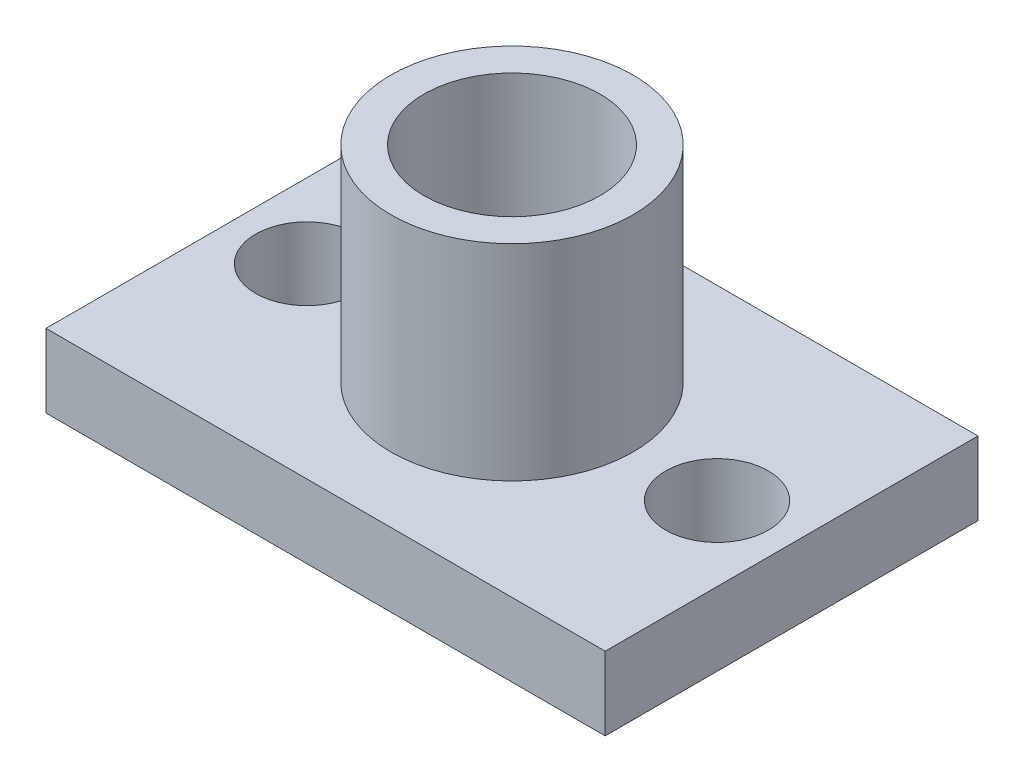
ISO-10303-21;
HEADER;
FILE_DESCRIPTION(('STEP AP214'),'2;1');
FILE_NAME('part.step','',(''),(''),'','','');
FILE_SCHEMA(('AUTOMOTIVE_DESIGN { 1 0 10303 214 1 1 1 1 }'));
ENDSEC;
DATA;
#1=APPLICATION_CONTEXT('core data for automotive mechanical design processes');
#2=APPLICATION_PROTOCOL_DEFINITION('international standard','automotive_design',2000,#1);
#3=PRODUCT_CONTEXT('',#1,'mechanical');
#4=PRODUCT('Part','Part','',(#3));
#5=PRODUCT_RELATED_PRODUCT_CATEGORY('part','',(#4));
#6=PRODUCT_DEFINITION_FORMATION('','',#4);
#7=PRODUCT_DEFINITION_CONTEXT('part definition',#1,'design');
#8=PRODUCT_DEFINITION('design','',#6,#7);
#9=PRODUCT_DEFINITION_SHAPE('','',#8);
#10=(LENGTH_UNIT() NAMED_UNIT(*) SI_UNIT(.MILLI.,.METRE.));
#11=(NAMED_UNIT(*) PLANE_ANGLE_UNIT() SI_UNIT($,.RADIAN.));
#12=(NAMED_UNIT(*) SI_UNIT($,.STERADIAN.) SOLID_ANGLE_UNIT());
#13=UNCERTAINTY_MEASURE_WITH_UNIT(LENGTH_MEASURE(1.E-05),#10,'distance_accuracy_value','');
#14=(GEOMETRIC_REPRESENTATION_CONTEXT(3) GLOBAL_UNCERTAINTY_ASSIGNED_CONTEXT((#13)) GLOBAL_UNIT_ASSIGNED_CONTEXT((#10,
#11,#12)) REPRESENTATION_CONTEXT('',''));
#15=CARTESIAN_POINT('',(0.,0.,0.));
#16=DIRECTION('',(0.,0.,1.));
#17=DIRECTION('',(1.,0.,0.));
#18=AXIS2_PLACEMENT_3D('',#15,#16,#17);
#19=CARTESIAN_POINT('',(0.,5.,0.));
#20=DIRECTION('',(0.,1.,0.));
#21=DIRECTION('',(0.,0.,1.));
#22=AXIS2_PLACEMENT_3D('',#19,#20,#21);
#23=PLANE('',#22);
#24=CARTESIAN_POINT('',(-20.7617391304348,5.,0.));
#25=DIRECTION('',(0.,1.,0.));
#26=DIRECTION('',(0.,0.,1.));
#27=AXIS2_PLACEMENT_3D('',#24,#25,#26);
#28=CIRCLE('',#27,3.5);
#29=CARTESIAN_POINT('',(-20.7617391304348,5.,3.5));
#30=VERTEX_POINT('',#29);
#31=EDGE_CURVE('E166',#30,#30,#28,.T.);
#32=ORIENTED_EDGE('',*,*,#31,.F.);
#33=EDGE_LOOP('',(#32));
#34=FACE_BOUND('',#33,.T.);
#35=CARTESIAN_POINT('',(7.17826086956524,5.,0.));
#36=DIRECTION('',(0.,1.,0.));
#37=DIRECTION('',(0.,0.,1.));
#38=AXIS2_PLACEMENT_3D('',#35,#36,#37);
#39=CIRCLE('',#38,3.5);
#40=CARTESIAN_POINT('',(7.17826086956524,5.,3.5));
#41=VERTEX_POINT('',#40);
#42=EDGE_CURVE('E168',#41,#41,#39,.T.);
#43=ORIENTED_EDGE('',*,*,#42,.F.);
#44=EDGE_LOOP('',(#43));
#45=FACE_BOUND('',#44,.T.);
#46=DIRECTION('',(0.,0.,1.));
#47=VECTOR('',#46,1.);
#48=CARTESIAN_POINT('',(-25.8417391304348,5.,-12.7));
#49=LINE('',#48,#47);
#50=CARTESIAN_POINT('',(-25.8417391304348,5.,-12.7));
#51=VERTEX_POINT('',#50);
#52=CARTESIAN_POINT('',(-25.8417391304348,5.,12.7));
#53=VERTEX_POINT('',#52);
#54=EDGE_CURVE('E86',#51,#53,#49,.T.);
#55=ORIENTED_EDGE('',*,*,#54,.T.);
#56=DIRECTION('',(1.,0.,0.));
#57=VECTOR('',#56,1.);
#58=CARTESIAN_POINT('',(-25.8417391304348,5.,12.7));
#59=LINE('',#58,#57);
#60=CARTESIAN_POINT('',(12.2582608695652,5.,12.7));
#61=VERTEX_POINT('',#60);
#62=EDGE_CURVE('E81',#53,#61,#59,.T.);
#63=ORIENTED_EDGE('',*,*,#62,.T.);
#64=DIRECTION('',(0.,0.,-1.));
#65=VECTOR('',#64,1.);
#66=CARTESIAN_POINT('',(12.2582608695652,5.,-12.7));
#67=LINE('',#66,#65);
#68=CARTESIAN_POINT('',(12.2582608695652,5.,-12.7));
#69=VERTEX_POINT('',#68);
#70=EDGE_CURVE('E84',#61,#69,#67,.T.);
#71=ORIENTED_EDGE('',*,*,#70,.T.);
#72=DIRECTION('',(-1.,0.,0.));
#73=VECTOR('',#72,1.);
#74=CARTESIAN_POINT('',(-25.8417391304348,5.,-12.7));
#75=LINE('',#74,#73);
#76=EDGE_CURVE('E50',#69,#51,#75,.T.);
#77=ORIENTED_EDGE('',*,*,#76,.T.);
#78=EDGE_LOOP('',(#55,#63,#71,#77));
#79=FACE_BOUND('',#78,.T.);
#80=CARTESIAN_POINT('',(-6.79173913043476,5.,0.));
#81=DIRECTION('',(0.,1.,0.));
#82=DIRECTION('',(0.,0.,1.));
#83=AXIS2_PLACEMENT_3D('',#80,#81,#82);
#84=CIRCLE('',#83,8.25);
#85=CARTESIAN_POINT('',(-6.79173913043476,5.,8.24999999999999));
#86=VERTEX_POINT('',#85);
#87=EDGE_CURVE('E178',#86,#86,#84,.T.);
#88=ORIENTED_EDGE('',*,*,#87,.F.);
#89=EDGE_LOOP('',(#88));
#90=FACE_BOUND('',#89,.T.);
#91=ADVANCED_FACE('F33',(#34,#45,#79,#90),#23,.T.);
#92=CARTESIAN_POINT('',(-25.8417391304348,5.,-12.7));
#93=DIRECTION('',(1.,0.,0.));
#94=DIRECTION('',(0.,0.,-1.));
#95=AXIS2_PLACEMENT_3D('',#92,#93,#94);
#96=PLANE('',#95);
#97=DIRECTION('',(0.,0.,1.));
#98=VECTOR('',#97,1.);
#99=CARTESIAN_POINT('',(-25.8417391304348,0.,-12.7));
#100=LINE('',#99,#98);
#101=CARTESIAN_POINT('',(-25.8417391304348,0.,-12.7));
#102=VERTEX_POINT('',#101);
#103=CARTESIAN_POINT('',(-25.8417391304348,0.,12.7));
#104=VERTEX_POINT('',#103);
#105=EDGE_CURVE('E100',#102,#104,#100,.T.);
#106=ORIENTED_EDGE('',*,*,#105,.T.);
#107=DIRECTION('',(0.,-1.,0.));
#108=VECTOR('',#107,1.);
#109=CARTESIAN_POINT('',(-25.8417391304348,5.,12.7));
#110=LINE('',#109,#108);
#111=EDGE_CURVE('E42',#53,#104,#110,.T.);
#112=ORIENTED_EDGE('',*,*,#111,.F.);
#113=ORIENTED_EDGE('',*,*,#54,.F.);
#114=DIRECTION('',(0.,-1.,0.));
#115=VECTOR('',#114,1.);
#116=CARTESIAN_POINT('',(-25.8417391304348,5.,-12.7));
#117=LINE('',#116,#115);
#118=EDGE_CURVE('E96',#51,#102,#117,.T.);
#119=ORIENTED_EDGE('',*,*,#118,.T.);
#120=EDGE_LOOP('',(#106,#112,#113,#119));
#121=FACE_BOUND('',#120,.T.);
#122=ADVANCED_FACE('F35',(#121),#96,.F.);
#123=CARTESIAN_POINT('',(-25.8417391304348,5.,12.7));
#124=DIRECTION('',(0.,0.,-1.));
#125=DIRECTION('',(-1.,0.,0.));
#126=AXIS2_PLACEMENT_3D('',#123,#124,#125);
#127=PLANE('',#126);
#128=DIRECTION('',(1.,0.,0.));
#129=VECTOR('',#128,1.);
#130=CARTESIAN_POINT('',(-25.8417391304348,0.,12.7));
#131=LINE('',#130,#129);
#132=CARTESIAN_POINT('',(12.2582608695652,0.,12.7));
#133=VERTEX_POINT('',#132);
#134=EDGE_CURVE('E91',#104,#133,#131,.T.);
#135=ORIENTED_EDGE('',*,*,#134,.T.);
#136=DIRECTION('',(0.,-1.,0.));
#137=VECTOR('',#136,1.);
#138=CARTESIAN_POINT('',(12.2582608695652,5.,12.7));
#139=LINE('',#138,#137);
#140=EDGE_CURVE('E89',#61,#133,#139,.T.);
#141=ORIENTED_EDGE('',*,*,#140,.F.);
#142=ORIENTED_EDGE('',*,*,#62,.F.);
#143=ORIENTED_EDGE('',*,*,#111,.T.);
#144=EDGE_LOOP('',(#135,#141,#142,#143));
#145=FACE_BOUND('',#144,.T.);
#146=ADVANCED_FACE('F90',(#145),#127,.F.);
#147=CARTESIAN_POINT('',(12.2582608695652,5.,-12.7));
#148=DIRECTION('',(-1.,0.,0.));
#149=DIRECTION('',(0.,0.,1.));
#150=AXIS2_PLACEMENT_3D('',#147,#148,#149);
#151=PLANE('',#150);
#152=DIRECTION('',(0.,0.,-1.));
#153=VECTOR('',#152,1.);
#154=CARTESIAN_POINT('',(12.2582608695652,0.,-12.7));
#155=LINE('',#154,#153);
#156=CARTESIAN_POINT('',(12.2582608695652,0.,-12.7));
#157=VERTEX_POINT('',#156);
#158=EDGE_CURVE('E67',#133,#157,#155,.T.);
#159=ORIENTED_EDGE('',*,*,#158,.T.);
#160=DIRECTION('',(0.,-1.,0.));
#161=VECTOR('',#160,1.);
#162=CARTESIAN_POINT('',(12.2582608695652,5.,-12.7));
#163=LINE('',#162,#161);
#164=EDGE_CURVE('E92',#69,#157,#163,.T.);
#165=ORIENTED_EDGE('',*,*,#164,.F.);
#166=ORIENTED_EDGE('',*,*,#70,.F.);
#167=ORIENTED_EDGE('',*,*,#140,.T.);
#168=EDGE_LOOP('',(#159,#165,#166,#167));
#169=FACE_BOUND('',#168,.T.);
#170=ADVANCED_FACE('F94',(#169),#151,.F.);
#171=CARTESIAN_POINT('',(-25.8417391304348,5.,-12.7));
#172=DIRECTION('',(0.,0.,1.));
#173=DIRECTION('',(1.,0.,0.));
#174=AXIS2_PLACEMENT_3D('',#171,#172,#173);
#175=PLANE('',#174);
#176=DIRECTION('',(-1.,0.,0.));
#177=VECTOR('',#176,1.);
#178=CARTESIAN_POINT('',(-25.8417391304348,0.,-12.7));
#179=LINE('',#178,#177);
#180=EDGE_CURVE('E73',#157,#102,#179,.T.);
#181=ORIENTED_EDGE('',*,*,#180,.T.);
#182=ORIENTED_EDGE('',*,*,#118,.F.);
#183=ORIENTED_EDGE('',*,*,#76,.F.);
#184=ORIENTED_EDGE('',*,*,#164,.T.);
#185=EDGE_LOOP('',(#181,#182,#183,#184));
#186=FACE_BOUND('',#185,.T.);
#187=ADVANCED_FACE('F114',(#186),#175,.F.);
#188=CARTESIAN_POINT('',(0.,0.,0.));
#189=DIRECTION('',(0.,1.,0.));
#190=DIRECTION('',(0.,0.,1.));
#191=AXIS2_PLACEMENT_3D('',#188,#189,#190);
#192=PLANE('',#191);
#193=CARTESIAN_POINT('',(-20.7617391304348,0.,0.));
#194=DIRECTION('',(0.,1.,0.));
#195=DIRECTION('',(0.,0.,1.));
#196=AXIS2_PLACEMENT_3D('',#193,#194,#195);
#197=CIRCLE('',#196,3.5);
#198=CARTESIAN_POINT('',(-20.7617391304348,0.,3.5));
#199=VERTEX_POINT('',#198);
#200=EDGE_CURVE('E164',#199,#199,#197,.T.);
#201=ORIENTED_EDGE('',*,*,#200,.T.);
#202=EDGE_LOOP('',(#201));
#203=FACE_BOUND('',#202,.T.);
#204=CARTESIAN_POINT('',(7.17826086956524,0.,0.));
#205=DIRECTION('',(0.,1.,0.));
#206=DIRECTION('',(0.,0.,1.));
#207=AXIS2_PLACEMENT_3D('',#204,#205,#206);
#208=CIRCLE('',#207,3.5);
#209=CARTESIAN_POINT('',(7.17826086956524,0.,3.5));
#210=VERTEX_POINT('',#209);
#211=EDGE_CURVE('E171',#210,#210,#208,.T.);
#212=ORIENTED_EDGE('',*,*,#211,.T.);
#213=EDGE_LOOP('',(#212));
#214=FACE_BOUND('',#213,.T.);
#215=ORIENTED_EDGE('',*,*,#105,.F.);
#216=ORIENTED_EDGE('',*,*,#180,.F.);
#217=ORIENTED_EDGE('',*,*,#158,.F.);
#218=ORIENTED_EDGE('',*,*,#134,.F.);
#219=EDGE_LOOP('',(#215,#216,#217,#218));
#220=FACE_BOUND('',#219,.T.);
#221=ADVANCED_FACE('F111',(#203,#214,#220),#192,.F.);
#222=CARTESIAN_POINT('',(-6.79173913043476,19.,0.));
#223=DIRECTION('',(0.,1.,0.));
#224=DIRECTION('',(0.,0.,1.));
#225=AXIS2_PLACEMENT_3D('',#222,#223,#224);
#226=PLANE('',#225);
#227=CARTESIAN_POINT('',(-6.79173913043476,19.,0.));
#228=DIRECTION('',(0.,1.,0.));
#229=DIRECTION('',(0.,0.,1.));
#230=AXIS2_PLACEMENT_3D('',#227,#228,#229);
#231=CIRCLE('',#230,8.25);
#232=CARTESIAN_POINT('',(-6.79173913043476,19.,8.24999999999999));
#233=VERTEX_POINT('',#232);
#234=EDGE_CURVE('E103',#233,#233,#231,.T.);
#235=ORIENTED_EDGE('',*,*,#234,.T.);
#236=EDGE_LOOP('',(#235));
#237=FACE_BOUND('',#236,.T.);
#238=CARTESIAN_POINT('',(-6.79173913043476,19.,0.));
#239=DIRECTION('',(0.,1.,0.));
#240=DIRECTION('',(0.,0.,1.));
#241=AXIS2_PLACEMENT_3D('',#238,#239,#240);
#242=CIRCLE('',#241,6.);
#243=CARTESIAN_POINT('',(-6.79173913043476,19.,5.99999999999999));
#244=VERTEX_POINT('',#243);
#245=EDGE_CURVE('E174',#244,#244,#242,.T.);
#246=ORIENTED_EDGE('',*,*,#245,.F.);
#247=EDGE_LOOP('',(#246));
#248=FACE_BOUND('',#247,.T.);
#249=ADVANCED_FACE('F113',(#237,#248),#226,.T.);
#250=CARTESIAN_POINT('',(-6.79173913043476,19.,0.));
#251=DIRECTION('',(0.,-1.,0.));
#252=DIRECTION('',(0.,0.,-1.));
#253=AXIS2_PLACEMENT_3D('',#250,#251,#252);
#254=CYLINDRICAL_SURFACE('',#253,8.25);
#255=ORIENTED_EDGE('',*,*,#234,.F.);
#256=EDGE_LOOP('',(#255));
#257=FACE_BOUND('',#256,.T.);
#258=ORIENTED_EDGE('',*,*,#87,.T.);
#259=EDGE_LOOP('',(#258));
#260=FACE_BOUND('',#259,.T.);
#261=ADVANCED_FACE('F121',(#257,#260),#254,.T.);
#262=CARTESIAN_POINT('',(-6.79173913043476,19.,0.));
#263=DIRECTION('',(0.,-1.,0.));
#264=DIRECTION('',(0.,0.,-1.));
#265=AXIS2_PLACEMENT_3D('',#262,#263,#264);
#266=CYLINDRICAL_SURFACE('',#265,6.);
#267=ORIENTED_EDGE('',*,*,#245,.T.);
#268=EDGE_LOOP('',(#267));
#269=FACE_BOUND('',#268,.T.);
#270=CARTESIAN_POINT('',(-6.79173913043476,5.,0.));
#271=DIRECTION('',(0.,1.,0.));
#272=DIRECTION('',(0.,0.,1.));
#273=AXIS2_PLACEMENT_3D('',#270,#271,#272);
#274=CIRCLE('',#273,6.);
#275=CARTESIAN_POINT('',(-6.79173913043476,5.,5.99999999999999));
#276=VERTEX_POINT('',#275);
#277=EDGE_CURVE('E11',#276,#276,#274,.F.);
#278=ORIENTED_EDGE('',*,*,#277,.T.);
#279=EDGE_LOOP('',(#278));
#280=FACE_BOUND('',#279,.T.);
#281=ADVANCED_FACE('F139',(#269,#280),#266,.F.);
#282=ORIENTED_EDGE('',*,*,#277,.F.);
#283=EDGE_LOOP('',(#282));
#284=FACE_BOUND('',#283,.T.);
#285=ADVANCED_FACE('F130',(#284),#23,.T.);
#286=CARTESIAN_POINT('',(7.17826086956524,0.,0.));
#287=DIRECTION('',(0.,1.,0.));
#288=DIRECTION('',(0.,0.,1.));
#289=AXIS2_PLACEMENT_3D('',#286,#287,#288);
#290=CYLINDRICAL_SURFACE('',#289,3.5);
#291=ORIENTED_EDGE('',*,*,#211,.F.);
#292=EDGE_LOOP('',(#291));
#293=FACE_BOUND('',#292,.T.);
#294=ORIENTED_EDGE('',*,*,#42,.T.);
#295=EDGE_LOOP('',(#294));
#296=FACE_BOUND('',#295,.T.);
#297=ADVANCED_FACE('F138',(#293,#296),#290,.F.);
#298=CARTESIAN_POINT('',(-20.7617391304348,0.,0.));
#299=DIRECTION('',(0.,1.,0.));
#300=DIRECTION('',(0.,0.,1.));
#301=AXIS2_PLACEMENT_3D('',#298,#299,#300);
#302=CYLINDRICAL_SURFACE('',#301,3.5);
#303=ORIENTED_EDGE('',*,*,#200,.F.);
#304=EDGE_LOOP('',(#303));
#305=FACE_BOUND('',#304,.T.);
#306=ORIENTED_EDGE('',*,*,#31,.T.);
#307=EDGE_LOOP('',(#306));
#308=FACE_BOUND('',#307,.T.);
#309=ADVANCED_FACE('F145',(#305,#308),#302,.F.);
#310=CLOSED_SHELL('',(#91,#122,#146,#170,#187,#221,#249,#261,#281,#285,#297,#309));
#311=MANIFOLD_SOLID_BREP('B2',#310);
#312=ADVANCED_BREP_SHAPE_REPRESENTATION('',(#18,#311),#14);
#313=SHAPE_DEFINITION_REPRESENTATION(#9,#312);
ENDSEC;
END-ISO-10303-21;
